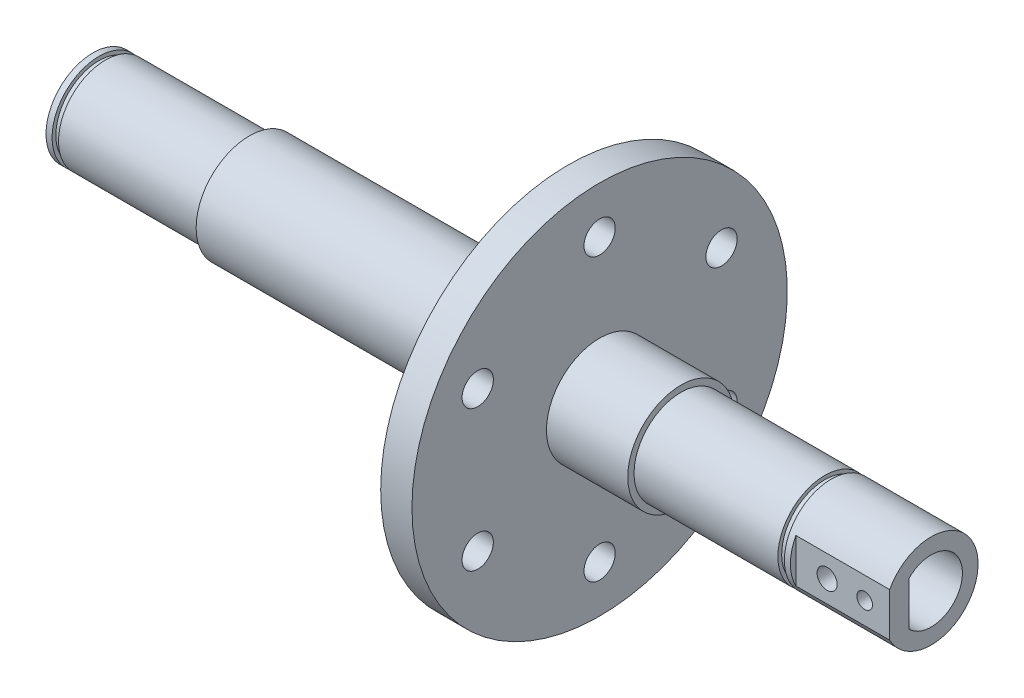
ISO-10303-21;
HEADER;
FILE_DESCRIPTION(('STEP AP214'),'2;1');
FILE_NAME('part.step','',(''),(''),'','','');
FILE_SCHEMA(('AUTOMOTIVE_DESIGN { 1 0 10303 214 1 1 1 1 }'));
ENDSEC;
DATA;
#1=APPLICATION_CONTEXT('core data for automotive mechanical design processes');
#2=APPLICATION_PROTOCOL_DEFINITION('international standard','automotive_design',2000,#1);
#3=PRODUCT_CONTEXT('',#1,'mechanical');
#4=PRODUCT('Part','Part','',(#3));
#5=PRODUCT_RELATED_PRODUCT_CATEGORY('part','',(#4));
#6=PRODUCT_DEFINITION_FORMATION('','',#4);
#7=PRODUCT_DEFINITION_CONTEXT('part definition',#1,'design');
#8=PRODUCT_DEFINITION('design','',#6,#7);
#9=PRODUCT_DEFINITION_SHAPE('','',#8);
#10=(LENGTH_UNIT() NAMED_UNIT(*) SI_UNIT(.MILLI.,.METRE.));
#11=(NAMED_UNIT(*) PLANE_ANGLE_UNIT() SI_UNIT($,.RADIAN.));
#12=(NAMED_UNIT(*) SI_UNIT($,.STERADIAN.) SOLID_ANGLE_UNIT());
#13=UNCERTAINTY_MEASURE_WITH_UNIT(LENGTH_MEASURE(1.E-05),#10,'distance_accuracy_value','');
#14=(GEOMETRIC_REPRESENTATION_CONTEXT(3) GLOBAL_UNCERTAINTY_ASSIGNED_CONTEXT((#13)) GLOBAL_UNIT_ASSIGNED_CONTEXT((#10,
#11,#12)) REPRESENTATION_CONTEXT('',''));
#15=CARTESIAN_POINT('',(0.,0.,0.));
#16=DIRECTION('',(0.,0.,1.));
#17=DIRECTION('',(1.,0.,0.));
#18=AXIS2_PLACEMENT_3D('',#15,#16,#17);
#19=CARTESIAN_POINT('',(0.,0.,0.));
#20=DIRECTION('',(-1.,0.,0.));
#21=DIRECTION('',(0.,0.,1.));
#22=AXIS2_PLACEMENT_3D('',#19,#20,#21);
#23=CYLINDRICAL_SURFACE('',#22,7.5);
#24=CARTESIAN_POINT('',(94.,0.,0.));
#25=DIRECTION('',(-1.,0.,0.));
#26=DIRECTION('',(0.,0.,1.));
#27=AXIS2_PLACEMENT_3D('',#24,#25,#26);
#28=CIRCLE('',#27,7.5);
#29=CARTESIAN_POINT('',(94.,0.,7.5));
#30=VERTEX_POINT('',#29);
#31=EDGE_CURVE('E52',#30,#30,#28,.T.);
#32=ORIENTED_EDGE('',*,*,#31,.F.);
#33=EDGE_LOOP('',(#32));
#34=FACE_BOUND('',#33,.T.);
#35=CARTESIAN_POINT('',(117.,0.,0.));
#36=DIRECTION('',(1.,0.,0.));
#37=DIRECTION('',(0.,1.,0.));
#38=AXIS2_PLACEMENT_3D('',#35,#36,#37);
#39=CIRCLE('',#38,7.5);
#40=CARTESIAN_POINT('',(117.,7.5,0.));
#41=VERTEX_POINT('',#40);
#42=EDGE_CURVE('E217',#41,#41,#39,.T.);
#43=ORIENTED_EDGE('',*,*,#42,.F.);
#44=EDGE_LOOP('',(#43));
#45=FACE_BOUND('',#44,.T.);
#46=ADVANCED_FACE('F43',(#34,#45),#23,.T.);
#47=CARTESIAN_POINT('',(0.,0.,0.));
#48=DIRECTION('',(-1.,0.,0.));
#49=DIRECTION('',(0.,0.,1.));
#50=AXIS2_PLACEMENT_3D('',#47,#48,#49);
#51=CYLINDRICAL_SURFACE('',#50,7.5);
#52=CARTESIAN_POINT('',(25.,0.,0.));
#53=DIRECTION('',(-1.,0.,0.));
#54=DIRECTION('',(0.,0.,1.));
#55=AXIS2_PLACEMENT_3D('',#52,#53,#54);
#56=CIRCLE('',#55,7.5);
#57=CARTESIAN_POINT('',(25.,0.,7.5));
#58=VERTEX_POINT('',#57);
#59=EDGE_CURVE('E178',#58,#58,#56,.T.);
#60=ORIENTED_EDGE('',*,*,#59,.T.);
#61=EDGE_LOOP('',(#60));
#62=FACE_BOUND('',#61,.T.);
#63=CARTESIAN_POINT('',(2.,0.,0.));
#64=DIRECTION('',(-1.,0.,0.));
#65=DIRECTION('',(0.,-1.,0.));
#66=AXIS2_PLACEMENT_3D('',#63,#64,#65);
#67=CIRCLE('',#66,7.5);
#68=CARTESIAN_POINT('',(2.,-7.5,0.));
#69=VERTEX_POINT('',#68);
#70=EDGE_CURVE('E237',#69,#69,#67,.T.);
#71=ORIENTED_EDGE('',*,*,#70,.F.);
#72=EDGE_LOOP('',(#71));
#73=FACE_BOUND('',#72,.T.);
#74=ADVANCED_FACE('F213',(#62,#73),#51,.T.);
#75=CARTESIAN_POINT('',(94.,8.5,0.));
#76=DIRECTION('',(-1.,0.,0.));
#77=DIRECTION('',(0.,0.,1.));
#78=AXIS2_PLACEMENT_3D('',#75,#76,#77);
#79=PLANE('',#78);
#80=CARTESIAN_POINT('',(94.,0.,0.));
#81=DIRECTION('',(-1.,0.,0.));
#82=DIRECTION('',(0.,0.,1.));
#83=AXIS2_PLACEMENT_3D('',#80,#81,#82);
#84=CIRCLE('',#83,8.5);
#85=CARTESIAN_POINT('',(94.,0.,8.5));
#86=VERTEX_POINT('',#85);
#87=EDGE_CURVE('E202',#86,#86,#84,.T.);
#88=ORIENTED_EDGE('',*,*,#87,.F.);
#89=EDGE_LOOP('',(#88));
#90=FACE_BOUND('',#89,.T.);
#91=ORIENTED_EDGE('',*,*,#31,.T.);
#92=EDGE_LOOP('',(#91));
#93=FACE_BOUND('',#92,.T.);
#94=ADVANCED_FACE('F209',(#90,#93),#79,.F.);
#95=CARTESIAN_POINT('',(0.,0.,0.));
#96=DIRECTION('',(-1.,0.,0.));
#97=DIRECTION('',(0.,0.,1.));
#98=AXIS2_PLACEMENT_3D('',#95,#96,#97);
#99=CYLINDRICAL_SURFACE('',#98,8.5);
#100=CARTESIAN_POINT('',(81.,0.,0.));
#101=DIRECTION('',(-1.,0.,0.));
#102=DIRECTION('',(0.,0.,1.));
#103=AXIS2_PLACEMENT_3D('',#100,#101,#102);
#104=CIRCLE('',#103,8.5);
#105=CARTESIAN_POINT('',(81.,0.,8.5));
#106=VERTEX_POINT('',#105);
#107=EDGE_CURVE('E198',#106,#106,#104,.T.);
#108=ORIENTED_EDGE('',*,*,#107,.F.);
#109=EDGE_LOOP('',(#108));
#110=FACE_BOUND('',#109,.T.);
#111=ORIENTED_EDGE('',*,*,#87,.T.);
#112=EDGE_LOOP('',(#111));
#113=FACE_BOUND('',#112,.T.);
#114=ADVANCED_FACE('F332',(#110,#113),#99,.T.);
#115=CARTESIAN_POINT('',(81.,8.5,0.));
#116=DIRECTION('',(-1.,0.,0.));
#117=DIRECTION('',(0.,0.,1.));
#118=AXIS2_PLACEMENT_3D('',#115,#116,#117);
#119=PLANE('',#118);
#120=CARTESIAN_POINT('',(81.,11.2500000000008,19.4855715851503));
#121=DIRECTION('',(-1.,0.,0.));
#122=DIRECTION('',(0.,0.,1.));
#123=AXIS2_PLACEMENT_3D('',#120,#121,#122);
#124=CIRCLE('',#123,2.50000000000027);
#125=CARTESIAN_POINT('',(81.,11.2500000000008,21.9855715851506));
#126=VERTEX_POINT('',#125);
#127=EDGE_CURVE('E162',#126,#126,#124,.T.);
#128=ORIENTED_EDGE('',*,*,#127,.T.);
#129=EDGE_LOOP('',(#128));
#130=FACE_BOUND('',#129,.T.);
#131=CARTESIAN_POINT('',(81.,-11.2499999999992,19.4855715851513));
#132=DIRECTION('',(-1.,0.,0.));
#133=DIRECTION('',(0.,0.,1.));
#134=AXIS2_PLACEMENT_3D('',#131,#132,#133);
#135=CIRCLE('',#134,2.50000000000123);
#136=CARTESIAN_POINT('',(81.,-11.2499999999992,21.9855715851525));
#137=VERTEX_POINT('',#136);
#138=EDGE_CURVE('E158',#137,#137,#135,.T.);
#139=ORIENTED_EDGE('',*,*,#138,.T.);
#140=EDGE_LOOP('',(#139));
#141=FACE_BOUND('',#140,.T.);
#142=CARTESIAN_POINT('',(81.,-22.5,1.91295447595611E-12));
#143=DIRECTION('',(-1.,0.,0.));
#144=DIRECTION('',(0.,0.,1.));
#145=AXIS2_PLACEMENT_3D('',#142,#143,#144);
#146=CIRCLE('',#145,2.50000000000198);
#147=CARTESIAN_POINT('',(81.,-22.5,2.50000000000389));
#148=VERTEX_POINT('',#147);
#149=EDGE_CURVE('E154',#148,#148,#146,.T.);
#150=ORIENTED_EDGE('',*,*,#149,.T.);
#151=EDGE_LOOP('',(#150));
#152=FACE_BOUND('',#151,.T.);
#153=CARTESIAN_POINT('',(81.,-11.2500000000008,-19.4855715851484));
#154=DIRECTION('',(-1.,0.,0.));
#155=DIRECTION('',(0.,0.,1.));
#156=AXIS2_PLACEMENT_3D('',#153,#154,#155);
#157=CIRCLE('',#156,2.50000000000183);
#158=CARTESIAN_POINT('',(81.,-11.2500000000008,-16.9855715851466));
#159=VERTEX_POINT('',#158);
#160=EDGE_CURVE('E150',#159,#159,#157,.T.);
#161=ORIENTED_EDGE('',*,*,#160,.T.);
#162=EDGE_LOOP('',(#161));
#163=FACE_BOUND('',#162,.T.);
#164=CARTESIAN_POINT('',(81.,11.2499999999992,-19.4855715851494));
#165=DIRECTION('',(-1.,0.,0.));
#166=DIRECTION('',(0.,0.,1.));
#167=AXIS2_PLACEMENT_3D('',#164,#165,#166);
#168=CIRCLE('',#167,2.50000000000097);
#169=CARTESIAN_POINT('',(81.,11.2499999999992,-16.9855715851484));
#170=VERTEX_POINT('',#169);
#171=EDGE_CURVE('E131',#170,#170,#168,.T.);
#172=ORIENTED_EDGE('',*,*,#171,.T.);
#173=EDGE_LOOP('',(#172));
#174=FACE_BOUND('',#173,.T.);
#175=CARTESIAN_POINT('',(81.,22.5,0.));
#176=DIRECTION('',(-1.,0.,0.));
#177=DIRECTION('',(0.,0.,1.));
#178=AXIS2_PLACEMENT_3D('',#175,#176,#177);
#179=CIRCLE('',#178,2.5);
#180=CARTESIAN_POINT('',(81.,22.5,2.5));
#181=VERTEX_POINT('',#180);
#182=EDGE_CURVE('E170',#181,#181,#179,.T.);
#183=ORIENTED_EDGE('',*,*,#182,.T.);
#184=EDGE_LOOP('',(#183));
#185=FACE_BOUND('',#184,.T.);
#186=CARTESIAN_POINT('',(81.,0.,0.));
#187=DIRECTION('',(-1.,0.,0.));
#188=DIRECTION('',(0.,0.,1.));
#189=AXIS2_PLACEMENT_3D('',#186,#187,#188);
#190=CIRCLE('',#189,30.);
#191=CARTESIAN_POINT('',(81.,0.,30.));
#192=VERTEX_POINT('',#191);
#193=EDGE_CURVE('E194',#192,#192,#190,.T.);
#194=ORIENTED_EDGE('',*,*,#193,.F.);
#195=EDGE_LOOP('',(#194));
#196=FACE_BOUND('',#195,.T.);
#197=ORIENTED_EDGE('',*,*,#107,.T.);
#198=EDGE_LOOP('',(#197));
#199=FACE_BOUND('',#198,.T.);
#200=ADVANCED_FACE('F336',(#130,#141,#152,#163,#174,#185,#196,#199),#119,.F.);
#201=CARTESIAN_POINT('',(0.,0.,0.));
#202=DIRECTION('',(-1.,0.,0.));
#203=DIRECTION('',(0.,0.,1.));
#204=AXIS2_PLACEMENT_3D('',#201,#202,#203);
#205=CYLINDRICAL_SURFACE('',#204,30.);
#206=CARTESIAN_POINT('',(76.,0.,0.));
#207=DIRECTION('',(-1.,0.,0.));
#208=DIRECTION('',(0.,0.,1.));
#209=AXIS2_PLACEMENT_3D('',#206,#207,#208);
#210=CIRCLE('',#209,30.);
#211=CARTESIAN_POINT('',(76.,0.,30.));
#212=VERTEX_POINT('',#211);
#213=EDGE_CURVE('E190',#212,#212,#210,.T.);
#214=ORIENTED_EDGE('',*,*,#213,.F.);
#215=EDGE_LOOP('',(#214));
#216=FACE_BOUND('',#215,.T.);
#217=ORIENTED_EDGE('',*,*,#193,.T.);
#218=EDGE_LOOP('',(#217));
#219=FACE_BOUND('',#218,.T.);
#220=ADVANCED_FACE('F340',(#216,#219),#205,.T.);
#221=CARTESIAN_POINT('',(76.,30.,0.));
#222=DIRECTION('',(1.,0.,0.));
#223=DIRECTION('',(0.,0.,-1.));
#224=AXIS2_PLACEMENT_3D('',#221,#222,#223);
#225=PLANE('',#224);
#226=CARTESIAN_POINT('',(76.,11.2500000000008,19.4855715851503));
#227=DIRECTION('',(-1.,0.,0.));
#228=DIRECTION('',(0.,-1.,0.));
#229=AXIS2_PLACEMENT_3D('',#226,#227,#228);
#230=CIRCLE('',#229,2.50000000000027);
#231=CARTESIAN_POINT('',(76.,8.75000000000056,19.4855715851503));
#232=VERTEX_POINT('',#231);
#233=EDGE_CURVE('E127',#232,#232,#230,.T.);
#234=ORIENTED_EDGE('',*,*,#233,.F.);
#235=EDGE_LOOP('',(#234));
#236=FACE_BOUND('',#235,.T.);
#237=CARTESIAN_POINT('',(76.,-11.2499999999992,19.4855715851513));
#238=DIRECTION('',(-1.,0.,0.));
#239=DIRECTION('',(0.,-1.,0.));
#240=AXIS2_PLACEMENT_3D('',#237,#238,#239);
#241=CIRCLE('',#240,2.50000000000123);
#242=CARTESIAN_POINT('',(76.,-13.7500000000004,19.4855715851513));
#243=VERTEX_POINT('',#242);
#244=EDGE_CURVE('E132',#243,#243,#241,.T.);
#245=ORIENTED_EDGE('',*,*,#244,.F.);
#246=EDGE_LOOP('',(#245));
#247=FACE_BOUND('',#246,.T.);
#248=CARTESIAN_POINT('',(76.,-22.5,1.91295447595611E-12));
#249=DIRECTION('',(-1.,0.,0.));
#250=DIRECTION('',(0.,-1.,0.));
#251=AXIS2_PLACEMENT_3D('',#248,#249,#250);
#252=CIRCLE('',#251,2.50000000000198);
#253=CARTESIAN_POINT('',(76.,-25.000000000002,1.91295447595611E-12));
#254=VERTEX_POINT('',#253);
#255=EDGE_CURVE('E136',#254,#254,#252,.T.);
#256=ORIENTED_EDGE('',*,*,#255,.F.);
#257=EDGE_LOOP('',(#256));
#258=FACE_BOUND('',#257,.T.);
#259=CARTESIAN_POINT('',(76.,-11.2500000000008,-19.4855715851484));
#260=DIRECTION('',(-1.,0.,0.));
#261=DIRECTION('',(0.,-1.,0.));
#262=AXIS2_PLACEMENT_3D('',#259,#260,#261);
#263=CIRCLE('',#262,2.50000000000183);
#264=CARTESIAN_POINT('',(76.,-13.7500000000027,-19.4855715851484));
#265=VERTEX_POINT('',#264);
#266=EDGE_CURVE('E140',#265,#265,#263,.T.);
#267=ORIENTED_EDGE('',*,*,#266,.F.);
#268=EDGE_LOOP('',(#267));
#269=FACE_BOUND('',#268,.T.);
#270=CARTESIAN_POINT('',(76.,11.2499999999992,-19.4855715851494));
#271=DIRECTION('',(-1.,0.,0.));
#272=DIRECTION('',(0.,-1.,0.));
#273=AXIS2_PLACEMENT_3D('',#270,#271,#272);
#274=CIRCLE('',#273,2.50000000000097);
#275=CARTESIAN_POINT('',(76.,8.74999999999819,-19.4855715851494));
#276=VERTEX_POINT('',#275);
#277=EDGE_CURVE('E124',#276,#276,#274,.T.);
#278=ORIENTED_EDGE('',*,*,#277,.F.);
#279=EDGE_LOOP('',(#278));
#280=FACE_BOUND('',#279,.T.);
#281=CARTESIAN_POINT('',(76.,22.5,0.));
#282=DIRECTION('',(-1.,0.,0.));
#283=DIRECTION('',(0.,-1.,0.));
#284=AXIS2_PLACEMENT_3D('',#281,#282,#283);
#285=CIRCLE('',#284,2.5);
#286=CARTESIAN_POINT('',(76.,20.,0.));
#287=VERTEX_POINT('',#286);
#288=EDGE_CURVE('E166',#287,#287,#285,.T.);
#289=ORIENTED_EDGE('',*,*,#288,.F.);
#290=EDGE_LOOP('',(#289));
#291=FACE_BOUND('',#290,.T.);
#292=CARTESIAN_POINT('',(76.,0.,0.));
#293=DIRECTION('',(-1.,0.,0.));
#294=DIRECTION('',(0.,0.,1.));
#295=AXIS2_PLACEMENT_3D('',#292,#293,#294);
#296=CIRCLE('',#295,8.5);
#297=CARTESIAN_POINT('',(76.,0.,8.5));
#298=VERTEX_POINT('',#297);
#299=EDGE_CURVE('E186',#298,#298,#296,.T.);
#300=ORIENTED_EDGE('',*,*,#299,.F.);
#301=EDGE_LOOP('',(#300));
#302=FACE_BOUND('',#301,.T.);
#303=ORIENTED_EDGE('',*,*,#213,.T.);
#304=EDGE_LOOP('',(#303));
#305=FACE_BOUND('',#304,.T.);
#306=ADVANCED_FACE('F344',(#236,#247,#258,#269,#280,#291,#302,#305),#225,.F.);
#307=CARTESIAN_POINT('',(0.,0.,0.));
#308=DIRECTION('',(-1.,0.,0.));
#309=DIRECTION('',(0.,0.,1.));
#310=AXIS2_PLACEMENT_3D('',#307,#308,#309);
#311=CYLINDRICAL_SURFACE('',#310,8.5);
#312=CARTESIAN_POINT('',(25.,0.,0.));
#313=DIRECTION('',(-1.,0.,0.));
#314=DIRECTION('',(0.,0.,1.));
#315=AXIS2_PLACEMENT_3D('',#312,#313,#314);
#316=CIRCLE('',#315,8.49999999999999);
#317=CARTESIAN_POINT('',(25.,0.,8.49999999999999));
#318=VERTEX_POINT('',#317);
#319=EDGE_CURVE('E182',#318,#318,#316,.T.);
#320=ORIENTED_EDGE('',*,*,#319,.F.);
#321=EDGE_LOOP('',(#320));
#322=FACE_BOUND('',#321,.T.);
#323=ORIENTED_EDGE('',*,*,#299,.T.);
#324=EDGE_LOOP('',(#323));
#325=FACE_BOUND('',#324,.T.);
#326=ADVANCED_FACE('F348',(#322,#325),#311,.T.);
#327=CARTESIAN_POINT('',(25.,8.49999999999999,0.));
#328=DIRECTION('',(1.,0.,0.));
#329=DIRECTION('',(0.,0.,-1.));
#330=AXIS2_PLACEMENT_3D('',#327,#328,#329);
#331=PLANE('',#330);
#332=ORIENTED_EDGE('',*,*,#59,.F.);
#333=EDGE_LOOP('',(#332));
#334=FACE_BOUND('',#333,.T.);
#335=ORIENTED_EDGE('',*,*,#319,.T.);
#336=EDGE_LOOP('',(#335));
#337=FACE_BOUND('',#336,.T.);
#338=ADVANCED_FACE('F352',(#334,#337),#331,.F.);
#339=CARTESIAN_POINT('',(134.,22.5,0.));
#340=DIRECTION('',(-1.,0.,0.));
#341=DIRECTION('',(0.,-1.,0.));
#342=AXIS2_PLACEMENT_3D('',#339,#340,#341);
#343=CYLINDRICAL_SURFACE('',#342,2.5);
#344=ORIENTED_EDGE('',*,*,#288,.T.);
#345=EDGE_LOOP('',(#344));
#346=FACE_BOUND('',#345,.T.);
#347=ORIENTED_EDGE('',*,*,#182,.F.);
#348=EDGE_LOOP('',(#347));
#349=FACE_BOUND('',#348,.T.);
#350=ADVANCED_FACE('F356',(#346,#349),#343,.F.);
#351=CARTESIAN_POINT('',(134.,11.2499999999992,-19.4855715851494));
#352=DIRECTION('',(-1.,0.,0.));
#353=DIRECTION('',(0.,-1.,0.));
#354=AXIS2_PLACEMENT_3D('',#351,#352,#353);
#355=CYLINDRICAL_SURFACE('',#354,2.50000000000097);
#356=ORIENTED_EDGE('',*,*,#277,.T.);
#357=EDGE_LOOP('',(#356));
#358=FACE_BOUND('',#357,.T.);
#359=ORIENTED_EDGE('',*,*,#171,.F.);
#360=EDGE_LOOP('',(#359));
#361=FACE_BOUND('',#360,.T.);
#362=ADVANCED_FACE('F365',(#358,#361),#355,.F.);
#363=CARTESIAN_POINT('',(134.,-11.2500000000008,-19.4855715851484));
#364=DIRECTION('',(-1.,0.,0.));
#365=DIRECTION('',(0.,-1.,0.));
#366=AXIS2_PLACEMENT_3D('',#363,#364,#365);
#367=CYLINDRICAL_SURFACE('',#366,2.50000000000183);
#368=ORIENTED_EDGE('',*,*,#266,.T.);
#369=EDGE_LOOP('',(#368));
#370=FACE_BOUND('',#369,.T.);
#371=ORIENTED_EDGE('',*,*,#160,.F.);
#372=EDGE_LOOP('',(#371));
#373=FACE_BOUND('',#372,.T.);
#374=ADVANCED_FACE('F369',(#370,#373),#367,.F.);
#375=CARTESIAN_POINT('',(134.,-22.5,1.91295447595611E-12));
#376=DIRECTION('',(-1.,0.,0.));
#377=DIRECTION('',(0.,-1.,0.));
#378=AXIS2_PLACEMENT_3D('',#375,#376,#377);
#379=CYLINDRICAL_SURFACE('',#378,2.50000000000198);
#380=ORIENTED_EDGE('',*,*,#255,.T.);
#381=EDGE_LOOP('',(#380));
#382=FACE_BOUND('',#381,.T.);
#383=ORIENTED_EDGE('',*,*,#149,.F.);
#384=EDGE_LOOP('',(#383));
#385=FACE_BOUND('',#384,.T.);
#386=ADVANCED_FACE('F373',(#382,#385),#379,.F.);
#387=CARTESIAN_POINT('',(134.,-11.2499999999992,19.4855715851513));
#388=DIRECTION('',(-1.,0.,0.));
#389=DIRECTION('',(0.,-1.,0.));
#390=AXIS2_PLACEMENT_3D('',#387,#388,#389);
#391=CYLINDRICAL_SURFACE('',#390,2.50000000000123);
#392=ORIENTED_EDGE('',*,*,#244,.T.);
#393=EDGE_LOOP('',(#392));
#394=FACE_BOUND('',#393,.T.);
#395=ORIENTED_EDGE('',*,*,#138,.F.);
#396=EDGE_LOOP('',(#395));
#397=FACE_BOUND('',#396,.T.);
#398=ADVANCED_FACE('F377',(#394,#397),#391,.F.);
#399=CARTESIAN_POINT('',(134.,11.2500000000008,19.4855715851503));
#400=DIRECTION('',(-1.,0.,0.));
#401=DIRECTION('',(0.,-1.,0.));
#402=AXIS2_PLACEMENT_3D('',#399,#400,#401);
#403=CYLINDRICAL_SURFACE('',#402,2.50000000000027);
#404=ORIENTED_EDGE('',*,*,#233,.T.);
#405=EDGE_LOOP('',(#404));
#406=FACE_BOUND('',#405,.T.);
#407=ORIENTED_EDGE('',*,*,#127,.F.);
#408=EDGE_LOOP('',(#407));
#409=FACE_BOUND('',#408,.T.);
#410=ADVANCED_FACE('F380',(#406,#409),#403,.F.);
#411=CARTESIAN_POINT('',(0.97,0.,0.));
#412=DIRECTION('',(-1.,0.,0.));
#413=DIRECTION('',(0.,-1.,0.));
#414=AXIS2_PLACEMENT_3D('',#411,#412,#413);
#415=PLANE('',#414);
#416=CARTESIAN_POINT('',(0.97,0.,0.));
#417=DIRECTION('',(-1.,0.,0.));
#418=DIRECTION('',(0.,-1.,0.));
#419=AXIS2_PLACEMENT_3D('',#416,#417,#418);
#420=CIRCLE('',#419,7.5);
#421=CARTESIAN_POINT('',(0.97,-7.5,0.));
#422=VERTEX_POINT('',#421);
#423=EDGE_CURVE('E241',#422,#422,#420,.T.);
#424=ORIENTED_EDGE('',*,*,#423,.F.);
#425=EDGE_LOOP('',(#424));
#426=FACE_BOUND('',#425,.T.);
#427=CARTESIAN_POINT('',(0.97,0.,0.));
#428=DIRECTION('',(-1.,0.,0.));
#429=DIRECTION('',(0.,-1.,0.));
#430=AXIS2_PLACEMENT_3D('',#427,#428,#429);
#431=CIRCLE('',#430,6.9);
#432=CARTESIAN_POINT('',(0.97,-6.9,0.));
#433=VERTEX_POINT('',#432);
#434=EDGE_CURVE('E233',#433,#433,#431,.T.);
#435=ORIENTED_EDGE('',*,*,#434,.T.);
#436=EDGE_LOOP('',(#435));
#437=FACE_BOUND('',#436,.T.);
#438=ADVANCED_FACE('F383',(#426,#437),#415,.F.);
#439=CARTESIAN_POINT('',(2.,0.,0.));
#440=DIRECTION('',(-1.,0.,0.));
#441=DIRECTION('',(0.,-1.,0.));
#442=AXIS2_PLACEMENT_3D('',#439,#440,#441);
#443=PLANE('',#442);
#444=ORIENTED_EDGE('',*,*,#70,.T.);
#445=EDGE_LOOP('',(#444));
#446=FACE_BOUND('',#445,.T.);
#447=CARTESIAN_POINT('',(2.,0.,0.));
#448=DIRECTION('',(-1.,0.,0.));
#449=DIRECTION('',(0.,-1.,0.));
#450=AXIS2_PLACEMENT_3D('',#447,#448,#449);
#451=CIRCLE('',#450,6.9);
#452=CARTESIAN_POINT('',(2.,-6.9,0.));
#453=VERTEX_POINT('',#452);
#454=EDGE_CURVE('E226',#453,#453,#451,.T.);
#455=ORIENTED_EDGE('',*,*,#454,.F.);
#456=EDGE_LOOP('',(#455));
#457=FACE_BOUND('',#456,.T.);
#458=ADVANCED_FACE('F388',(#446,#457),#443,.T.);
#459=CARTESIAN_POINT('',(0.97,0.,0.));
#460=DIRECTION('',(1.,0.,0.));
#461=DIRECTION('',(0.,1.,0.));
#462=AXIS2_PLACEMENT_3D('',#459,#460,#461);
#463=CYLINDRICAL_SURFACE('',#462,6.9);
#464=ORIENTED_EDGE('',*,*,#434,.F.);
#465=EDGE_LOOP('',(#464));
#466=FACE_BOUND('',#465,.T.);
#467=ORIENTED_EDGE('',*,*,#454,.T.);
#468=EDGE_LOOP('',(#467));
#469=FACE_BOUND('',#468,.T.);
#470=ADVANCED_FACE('F434',(#466,#469),#463,.T.);
#471=CARTESIAN_POINT('',(0.,7.5,0.));
#472=DIRECTION('',(1.,0.,0.));
#473=DIRECTION('',(0.,0.,-1.));
#474=AXIS2_PLACEMENT_3D('',#471,#472,#473);
#475=PLANE('',#474);
#476=CARTESIAN_POINT('',(0.,0.,0.));
#477=DIRECTION('',(-1.,0.,0.));
#478=DIRECTION('',(0.,0.,1.));
#479=AXIS2_PLACEMENT_3D('',#476,#477,#478);
#480=CIRCLE('',#479,7.5);
#481=CARTESIAN_POINT('',(0.,0.,7.5));
#482=VERTEX_POINT('',#481);
#483=EDGE_CURVE('E174',#482,#482,#480,.T.);
#484=ORIENTED_EDGE('',*,*,#483,.T.);
#485=EDGE_LOOP('',(#484));
#486=FACE_BOUND('',#485,.T.);
#487=ADVANCED_FACE('F45',(#486),#475,.F.);
#488=ORIENTED_EDGE('',*,*,#423,.T.);
#489=EDGE_LOOP('',(#488));
#490=FACE_BOUND('',#489,.T.);
#491=ORIENTED_EDGE('',*,*,#483,.F.);
#492=EDGE_LOOP('',(#491));
#493=FACE_BOUND('',#492,.T.);
#494=ADVANCED_FACE('F358',(#490,#493),#51,.T.);
#495=CARTESIAN_POINT('',(118.03,0.,0.));
#496=DIRECTION('',(1.,0.,0.));
#497=DIRECTION('',(0.,1.,0.));
#498=AXIS2_PLACEMENT_3D('',#495,#496,#497);
#499=PLANE('',#498);
#500=CARTESIAN_POINT('',(118.03,0.,0.));
#501=DIRECTION('',(1.,0.,0.));
#502=DIRECTION('',(0.,1.,0.));
#503=AXIS2_PLACEMENT_3D('',#500,#501,#502);
#504=CIRCLE('',#503,7.5);
#505=CARTESIAN_POINT('',(118.03,7.5,0.));
#506=VERTEX_POINT('',#505);
#507=EDGE_CURVE('E220',#506,#506,#504,.T.);
#508=ORIENTED_EDGE('',*,*,#507,.F.);
#509=EDGE_LOOP('',(#508));
#510=FACE_BOUND('',#509,.T.);
#511=CARTESIAN_POINT('',(118.03,0.,0.));
#512=DIRECTION('',(1.,0.,0.));
#513=DIRECTION('',(0.,1.,0.));
#514=AXIS2_PLACEMENT_3D('',#511,#512,#513);
#515=CIRCLE('',#514,6.9);
#516=CARTESIAN_POINT('',(118.03,6.9,0.));
#517=VERTEX_POINT('',#516);
#518=EDGE_CURVE('E221',#517,#517,#515,.T.);
#519=ORIENTED_EDGE('',*,*,#518,.T.);
#520=EDGE_LOOP('',(#519));
#521=FACE_BOUND('',#520,.T.);
#522=ADVANCED_FACE('F361',(#510,#521),#499,.F.);
#523=CARTESIAN_POINT('',(117.,0.,0.));
#524=DIRECTION('',(1.,0.,0.));
#525=DIRECTION('',(0.,1.,0.));
#526=AXIS2_PLACEMENT_3D('',#523,#524,#525);
#527=PLANE('',#526);
#528=ORIENTED_EDGE('',*,*,#42,.T.);
#529=EDGE_LOOP('',(#528));
#530=FACE_BOUND('',#529,.T.);
#531=CARTESIAN_POINT('',(117.,0.,0.));
#532=DIRECTION('',(1.,0.,0.));
#533=DIRECTION('',(0.,1.,0.));
#534=AXIS2_PLACEMENT_3D('',#531,#532,#533);
#535=CIRCLE('',#534,6.9);
#536=CARTESIAN_POINT('',(117.,6.9,0.));
#537=VERTEX_POINT('',#536);
#538=EDGE_CURVE('E229',#537,#537,#535,.T.);
#539=ORIENTED_EDGE('',*,*,#538,.F.);
#540=EDGE_LOOP('',(#539));
#541=FACE_BOUND('',#540,.T.);
#542=ADVANCED_FACE('F442',(#530,#541),#527,.T.);
#543=CARTESIAN_POINT('',(118.03,0.,0.));
#544=DIRECTION('',(-1.,0.,0.));
#545=DIRECTION('',(0.,-1.,0.));
#546=AXIS2_PLACEMENT_3D('',#543,#544,#545);
#547=CYLINDRICAL_SURFACE('',#546,6.9);
#548=ORIENTED_EDGE('',*,*,#518,.F.);
#549=EDGE_LOOP('',(#548));
#550=FACE_BOUND('',#549,.T.);
#551=ORIENTED_EDGE('',*,*,#538,.T.);
#552=EDGE_LOOP('',(#551));
#553=FACE_BOUND('',#552,.T.);
#554=ADVANCED_FACE('F297',(#550,#553),#547,.T.);
#555=CARTESIAN_POINT('',(120.,0.,0.));
#556=DIRECTION('',(1.,0.,0.));
#557=DIRECTION('',(0.,1.,0.));
#558=AXIS2_PLACEMENT_3D('',#555,#556,#557);
#559=PLANE('',#558);
#560=CARTESIAN_POINT('',(120.,0.,0.));
#561=DIRECTION('',(1.,0.,0.));
#562=DIRECTION('',(0.,1.,0.));
#563=AXIS2_PLACEMENT_3D('',#560,#561,#562);
#564=CIRCLE('',#563,5.);
#565=CARTESIAN_POINT('',(120.,-3.5,3.57071421427143));
#566=VERTEX_POINT('',#565);
#567=CARTESIAN_POINT('',(120.,3.5,3.57071421427143));
#568=VERTEX_POINT('',#567);
#569=EDGE_CURVE('E106',#566,#568,#564,.T.);
#570=ORIENTED_EDGE('',*,*,#569,.T.);
#571=DIRECTION('',(0.,-1.,0.));
#572=VECTOR('',#571,1.);
#573=CARTESIAN_POINT('',(120.,3.5,3.57071421427143));
#574=LINE('',#573,#572);
#575=EDGE_CURVE('E110',#568,#566,#574,.T.);
#576=ORIENTED_EDGE('',*,*,#575,.T.);
#577=EDGE_LOOP('',(#570,#576));
#578=FACE_BOUND('',#577,.T.);
#579=ADVANCED_FACE('F295',(#578),#559,.T.);
#580=CARTESIAN_POINT('',(124.,0.,-30.));
#581=DIRECTION('',(0.,0.,1.));
#582=DIRECTION('',(1.,0.,0.));
#583=AXIS2_PLACEMENT_3D('',#580,#581,#582);
#584=CYLINDRICAL_SURFACE('',#583,1.60000000000002);
#585=CARTESIAN_POINT('',(124.,0.,6.6332495807108));
#586=DIRECTION('',(0.,0.,1.));
#587=DIRECTION('',(1.,0.,0.));
#588=AXIS2_PLACEMENT_3D('',#585,#586,#587);
#589=CIRCLE('',#588,1.60000000000002);
#590=CARTESIAN_POINT('',(125.6,0.,6.6332495807108));
#591=VERTEX_POINT('',#590);
#592=EDGE_CURVE('E256',#591,#591,#589,.T.);
#593=ORIENTED_EDGE('',*,*,#592,.T.);
#594=EDGE_LOOP('',(#593));
#595=FACE_BOUND('',#594,.T.);
#596=CARTESIAN_POINT('',(124.,0.,3.57071421427142));
#597=DIRECTION('',(0.,0.,1.));
#598=DIRECTION('',(1.,0.,0.));
#599=AXIS2_PLACEMENT_3D('',#596,#597,#598);
#600=CIRCLE('',#599,1.60000000000002);
#601=CARTESIAN_POINT('',(125.6,0.,3.57071421427142));
#602=VERTEX_POINT('',#601);
#603=EDGE_CURVE('E260',#602,#602,#600,.T.);
#604=ORIENTED_EDGE('',*,*,#603,.F.);
#605=EDGE_LOOP('',(#604));
#606=FACE_BOUND('',#605,.T.);
#607=ADVANCED_FACE('F286',(#595,#606),#584,.F.);
#608=CARTESIAN_POINT('',(130.,0.,6.6332495807108));
#609=DIRECTION('',(0.,0.,1.));
#610=DIRECTION('',(1.,0.,0.));
#611=AXIS2_PLACEMENT_3D('',#608,#609,#610);
#612=CYLINDRICAL_SURFACE('',#611,1.25);
#613=CARTESIAN_POINT('',(130.,0.,6.6332495807108));
#614=DIRECTION('',(0.,0.,1.));
#615=DIRECTION('',(1.,0.,0.));
#616=AXIS2_PLACEMENT_3D('',#613,#614,#615);
#617=CIRCLE('',#616,1.25);
#618=CARTESIAN_POINT('',(131.25,0.,6.6332495807108));
#619=VERTEX_POINT('',#618);
#620=EDGE_CURVE('E245',#619,#619,#617,.T.);
#621=ORIENTED_EDGE('',*,*,#620,.T.);
#622=EDGE_LOOP('',(#621));
#623=FACE_BOUND('',#622,.T.);
#624=CARTESIAN_POINT('',(130.,0.,3.57071421427143));
#625=DIRECTION('',(0.,0.,1.));
#626=DIRECTION('',(1.,0.,0.));
#627=AXIS2_PLACEMENT_3D('',#624,#625,#626);
#628=CIRCLE('',#627,1.25);
#629=CARTESIAN_POINT('',(131.25,0.,3.57071421427143));
#630=VERTEX_POINT('',#629);
#631=EDGE_CURVE('E252',#630,#630,#628,.T.);
#632=ORIENTED_EDGE('',*,*,#631,.F.);
#633=EDGE_LOOP('',(#632));
#634=FACE_BOUND('',#633,.T.);
#635=ADVANCED_FACE('F287',(#623,#634),#612,.F.);
#636=CARTESIAN_POINT('',(120.,3.5,3.57071421427143));
#637=DIRECTION('',(0.,0.,1.));
#638=DIRECTION('',(1.,0.,0.));
#639=AXIS2_PLACEMENT_3D('',#636,#637,#638);
#640=PLANE('',#639);
#641=ORIENTED_EDGE('',*,*,#631,.T.);
#642=EDGE_LOOP('',(#641));
#643=FACE_BOUND('',#642,.T.);
#644=ORIENTED_EDGE('',*,*,#603,.T.);
#645=EDGE_LOOP('',(#644));
#646=FACE_BOUND('',#645,.T.);
#647=DIRECTION('',(0.,-1.,0.));
#648=VECTOR('',#647,1.);
#649=CARTESIAN_POINT('',(134.,3.5,3.57071421427143));
#650=LINE('',#649,#648);
#651=CARTESIAN_POINT('',(134.,3.5,3.57071421427143));
#652=VERTEX_POINT('',#651);
#653=CARTESIAN_POINT('',(134.,-3.5,3.57071421427143));
#654=VERTEX_POINT('',#653);
#655=EDGE_CURVE('E111',#652,#654,#650,.T.);
#656=ORIENTED_EDGE('',*,*,#655,.T.);
#657=DIRECTION('',(1.,0.,0.));
#658=VECTOR('',#657,1.);
#659=CARTESIAN_POINT('',(120.,-3.5,3.57071421427143));
#660=LINE('',#659,#658);
#661=EDGE_CURVE('E121',#566,#654,#660,.T.);
#662=ORIENTED_EDGE('',*,*,#661,.F.);
#663=ORIENTED_EDGE('',*,*,#575,.F.);
#664=DIRECTION('',(1.,0.,0.));
#665=VECTOR('',#664,1.);
#666=CARTESIAN_POINT('',(120.,3.5,3.57071421427143));
#667=LINE('',#666,#665);
#668=EDGE_CURVE('E115',#568,#652,#667,.T.);
#669=ORIENTED_EDGE('',*,*,#668,.T.);
#670=EDGE_LOOP('',(#656,#662,#663,#669));
#671=FACE_BOUND('',#670,.T.);
#672=ADVANCED_FACE('F299',(#643,#646,#671),#640,.F.);
#673=CARTESIAN_POINT('',(120.,0.,0.));
#674=DIRECTION('',(1.,0.,0.));
#675=DIRECTION('',(0.,1.,0.));
#676=AXIS2_PLACEMENT_3D('',#673,#674,#675);
#677=CYLINDRICAL_SURFACE('',#676,5.);
#678=CARTESIAN_POINT('',(125.6,0.,-5.));
#679=CARTESIAN_POINT('',(125.599999756349,-0.0874958063159813,-4.99999978543627));
#680=CARTESIAN_POINT('',(125.592799404721,-0.174994637059064,-4.99768184156355));
#681=CARTESIAN_POINT('',(125.564268180471,-0.347426901237488,-4.98866262172227));
#682=CARTESIAN_POINT('',(125.542934728182,-0.432359863373714,-4.98196054553558));
#683=CARTESIAN_POINT('',(125.486935078788,-0.597149225791573,-4.9649038363541));
#684=CARTESIAN_POINT('',(125.452290107629,-0.677013473384605,-4.95455502045191));
#685=CARTESIAN_POINT('',(125.370743169913,-0.829798762851168,-4.93126901642872));
#686=CARTESIAN_POINT('',(125.323839094234,-0.902718607024957,-4.91833138300385));
#687=CARTESIAN_POINT('',(125.217515886496,-1.041894757795,-4.89077067933825));
#688=CARTESIAN_POINT('',(125.157772901047,-1.10789609224642,-4.87610957732917));
#689=CARTESIAN_POINT('',(125.028156933453,-1.2291342369323,-4.8469706570307));
#690=CARTESIAN_POINT('',(124.958281952345,-1.28436891793799,-4.83249287552328));
#691=CARTESIAN_POINT('',(124.80814714549,-1.38391395073833,-4.80494810799029));
#692=CARTESIAN_POINT('',(124.727663718729,-1.42790123109946,-4.79192785635416));
#693=CARTESIAN_POINT('',(124.55995765623,-1.50160917134592,-4.76934657798645));
#694=CARTESIAN_POINT('',(124.472736902012,-1.53133379773328,-4.75978458968015));
#695=CARTESIAN_POINT('',(124.296917392727,-1.57473134311323,-4.74560122760596));
#696=CARTESIAN_POINT('',(124.208447898248,-1.58887896846388,-4.74083414932744));
#697=CARTESIAN_POINT('',(124.030272400816,-1.60220433058853,-4.73634831044999));
#698=CARTESIAN_POINT('',(123.940566752148,-1.60138627093722,-4.73662813227305));
#699=CARTESIAN_POINT('',(123.766434415112,-1.58517380736383,-4.74207619100074));
#700=CARTESIAN_POINT('',(123.681943546555,-1.57038842132727,-4.74704017430419));
#701=CARTESIAN_POINT('',(123.516711155578,-1.52765058974141,-4.76096457446161));
#702=CARTESIAN_POINT('',(123.435970050415,-1.49969668269329,-4.76992543490024));
#703=CARTESIAN_POINT('',(123.279102141174,-1.43099645158814,-4.79098654163639));
#704=CARTESIAN_POINT('',(123.203063780049,-1.39006273103724,-4.80313229469362));
#705=CARTESIAN_POINT('',(123.058737956973,-1.29669494334069,-4.82917444861167));
#706=CARTESIAN_POINT('',(122.990452597256,-1.24425776827157,-4.8430713221454));
#707=CARTESIAN_POINT('',(122.860135327134,-1.12640551540389,-4.87186372141871));
#708=CARTESIAN_POINT('',(122.798559223061,-1.06048936249404,-4.8867752080818));
#709=CARTESIAN_POINT('',(122.687221321766,-0.919081432217165,-4.91533168114877));
#710=CARTESIAN_POINT('',(122.637460486857,-0.843588875652712,-4.92897656433706));
#711=CARTESIAN_POINT('',(122.55083655672,-0.68426158071239,-4.95361789744584));
#712=CARTESIAN_POINT('',(122.514086899164,-0.600361279440649,-4.96459080547942));
#713=CARTESIAN_POINT('',(122.455360403337,-0.427135850361139,-4.98248161100196));
#714=CARTESIAN_POINT('',(122.433378852183,-0.337812463131553,-4.98940080204637));
#715=CARTESIAN_POINT('',(122.405599933335,-0.16014178958932,-4.99819424239135));
#716=CARTESIAN_POINT('',(122.399185926389,-0.0719002860170746,-5.00026060178154));
#717=CARTESIAN_POINT('',(122.400979218221,0.104410269588107,-4.99968655318444));
#718=CARTESIAN_POINT('',(122.40918426531,0.192479346087442,-4.99704687004206));
#719=CARTESIAN_POINT('',(122.439490113081,0.363535018203817,-4.98748380317497));
#720=CARTESIAN_POINT('',(122.461219910086,0.446594362478029,-4.98067486649266));
#721=CARTESIAN_POINT('',(122.517501799396,0.60786165460059,-4.96357585995349));
#722=CARTESIAN_POINT('',(122.552055496602,0.686068993794134,-4.95328535439546));
#723=CARTESIAN_POINT('',(122.633971017178,0.837596923870455,-4.92995531019905));
#724=CARTESIAN_POINT('',(122.681632511942,0.910745620500976,-4.9168532627009));
#725=CARTESIAN_POINT('',(122.788053872986,1.04821150300663,-4.8893940824048));
#726=CARTESIAN_POINT('',(122.846816886458,1.112526175554,-4.87503659432078));
#727=CARTESIAN_POINT('',(122.976674159611,1.23328321488637,-4.84592967283237));
#728=CARTESIAN_POINT('',(123.048180267688,1.28928579475622,-4.83118884166734));
#729=CARTESIAN_POINT('',(123.199894674458,1.38854141992571,-4.80360443110144));
#730=CARTESIAN_POINT('',(123.280102901454,1.43179457025643,-4.79076083607138));
#731=CARTESIAN_POINT('',(123.446843578656,1.50407580301233,-4.76856262886575));
#732=CARTESIAN_POINT('',(123.53335413499,1.53315066307448,-4.75919656820051));
#733=CARTESIAN_POINT('',(123.71040720981,1.57620668246203,-4.74511281699327));
#734=CARTESIAN_POINT('',(123.800948081136,1.59019395006569,-4.74039324536733));
#735=CARTESIAN_POINT('',(123.978875969164,1.60222535311568,-4.73633927898767));
#736=CARTESIAN_POINT('',(124.066209011329,1.60099388446008,-4.73676019091381));
#737=CARTESIAN_POINT('',(124.239357005435,1.58438355149372,-4.74234159093744));
#738=CARTESIAN_POINT('',(124.325172034561,1.56900540861123,-4.74750183734631));
#739=CARTESIAN_POINT('',(124.491483425377,1.52503332416463,-4.76180543144415));
#740=CARTESIAN_POINT('',(124.572043198893,1.49665627942708,-4.77088327236762));
#741=CARTESIAN_POINT('',(124.727321760401,1.42766427484384,-4.79197975594361));
#742=CARTESIAN_POINT('',(124.802039315763,1.38704674114627,-4.80399901699919));
#743=CARTESIAN_POINT('',(124.946809629814,1.29279266707433,-4.83023494368376));
#744=CARTESIAN_POINT('',(125.016548262734,1.23869308431579,-4.8445211905268));
#745=CARTESIAN_POINT('',(125.146191745821,1.11981399792886,-4.87337180847353));
#746=CARTESIAN_POINT('',(125.206093905199,1.05503158166824,-4.88793625446695));
#747=CARTESIAN_POINT('',(125.316458285924,0.913912210298368,-4.91631108200117));
#748=CARTESIAN_POINT('',(125.366518951884,0.837251351760798,-4.93007751880385));
#749=CARTESIAN_POINT('',(125.452980188097,0.676163529926958,-4.9547378769786));
#750=CARTESIAN_POINT('',(125.489385479321,0.591739263208179,-4.96563279071293));
#751=CARTESIAN_POINT('',(125.54524777983,0.423663431644866,-4.98268341064065));
#752=CARTESIAN_POINT('',(125.565718450583,0.34037676648735,-4.9891190130145));
#753=CARTESIAN_POINT('',(125.593093142904,0.171394001076131,-4.99777693541394));
#754=CARTESIAN_POINT('',(125.600000238645,0.0856984512614005,-5.00000021015613));
#755=CARTESIAN_POINT('',(125.6,0.,-5.));
#756=B_SPLINE_CURVE_WITH_KNOTS('',3,(#678,#679,#680,#681,#682,#683,#684,#685,#686,#687,#688,
#689,#690,#691,#692,#693,#694,#695,#696,#697,#698,#699,#700,#701,#702,#703,#704,#705,#706,#707,
#708,#709,#710,#711,#712,#713,#714,#715,#716,#717,#718,#719,#720,#721,#722,#723,#724,#725,#726,
#727,#728,#729,#730,#731,#732,#733,#734,#735,#736,#737,#738,#739,#740,#741,#742,#743,#744,#745,
#746,#747,#748,#749,#750,#751,#752,#753,#754,#755),.UNSPECIFIED.,.T.,.F.,(4,2,2,2,2,2,2,2,2,2,2,
2,2,2,2,2,2,2,2,2,2,2,2,2,2,2,2,2,2,2,2,2,2,2,2,2,2,2,4),(0.,0.26217228986649,0.524392446348371,
0.786196202111721,1.04804502964705,1.3174971815157,1.58700256668428,1.86354828826629,
2.14001705671958,2.40780489999511,2.67551752794227,2.93207089351449,3.18865273918782,
3.44912195934767,3.70966163813013,3.98267284808628,4.25570628624559,4.531064713342,
4.80633522466355,5.07051010591351,5.33464430132706,5.59183416387796,5.8490562243834,
6.11273355055089,6.37648573964826,6.65122993053069,6.92597185797951,7.19980110675114,
7.47351945288805,7.73426134972858,7.99498995043,8.25151822881327,8.50810048600716,
8.77513756675935,9.04224757485595,9.31866285531271,9.5949824844974,9.85182740305359,
10.1086141011963),.UNSPECIFIED.);
#757=CARTESIAN_POINT('',(125.6,0.,-5.));
#758=VERTEX_POINT('',#757);
#759=EDGE_CURVE('E264',#758,#758,#756,.T.);
#760=ORIENTED_EDGE('',*,*,#759,.T.);
#761=EDGE_LOOP('',(#760));
#762=FACE_BOUND('',#761,.T.);
#763=CARTESIAN_POINT('',(134.,0.,0.));
#764=DIRECTION('',(1.,0.,0.));
#765=DIRECTION('',(0.,1.,0.));
#766=AXIS2_PLACEMENT_3D('',#763,#764,#765);
#767=CIRCLE('',#766,5.);
#768=EDGE_CURVE('E66',#654,#652,#767,.T.);
#769=ORIENTED_EDGE('',*,*,#768,.T.);
#770=ORIENTED_EDGE('',*,*,#668,.F.);
#771=ORIENTED_EDGE('',*,*,#569,.F.);
#772=ORIENTED_EDGE('',*,*,#661,.T.);
#773=EDGE_LOOP('',(#769,#770,#771,#772));
#774=FACE_BOUND('',#773,.T.);
#775=ADVANCED_FACE('F275',(#762,#774),#677,.F.);
#776=CARTESIAN_POINT('',(119.,0.,0.));
#777=DIRECTION('',(1.,0.,0.));
#778=DIRECTION('',(0.,1.,0.));
#779=AXIS2_PLACEMENT_3D('',#776,#777,#778);
#780=PLANE('',#779);
#781=CARTESIAN_POINT('',(119.,0.,0.));
#782=DIRECTION('',(1.,0.,0.));
#783=DIRECTION('',(0.,1.,0.));
#784=AXIS2_PLACEMENT_3D('',#781,#782,#783);
#785=CIRCLE('',#784,7.5);
#786=CARTESIAN_POINT('',(119.,3.5,6.6332495807108));
#787=VERTEX_POINT('',#786);
#788=CARTESIAN_POINT('',(119.,-3.5,6.6332495807108));
#789=VERTEX_POINT('',#788);
#790=EDGE_CURVE('E83',#787,#789,#785,.T.);
#791=ORIENTED_EDGE('',*,*,#790,.T.);
#792=DIRECTION('',(0.,1.,0.));
#793=VECTOR('',#792,1.);
#794=CARTESIAN_POINT('',(119.,3.5,6.6332495807108));
#795=LINE('',#794,#793);
#796=EDGE_CURVE('E58',#789,#787,#795,.T.);
#797=ORIENTED_EDGE('',*,*,#796,.T.);
#798=EDGE_LOOP('',(#791,#797));
#799=FACE_BOUND('',#798,.T.);
#800=ADVANCED_FACE('F84',(#799),#780,.T.);
#801=CARTESIAN_POINT('',(119.,3.5,6.6332495807108));
#802=DIRECTION('',(0.,0.,-1.));
#803=DIRECTION('',(-1.,0.,0.));
#804=AXIS2_PLACEMENT_3D('',#801,#802,#803);
#805=PLANE('',#804);
#806=ORIENTED_EDGE('',*,*,#620,.F.);
#807=EDGE_LOOP('',(#806));
#808=FACE_BOUND('',#807,.T.);
#809=ORIENTED_EDGE('',*,*,#592,.F.);
#810=EDGE_LOOP('',(#809));
#811=FACE_BOUND('',#810,.T.);
#812=DIRECTION('',(0.,1.,0.));
#813=VECTOR('',#812,1.);
#814=CARTESIAN_POINT('',(134.,3.5,6.6332495807108));
#815=LINE('',#814,#813);
#816=CARTESIAN_POINT('',(134.,-3.5,6.6332495807108));
#817=VERTEX_POINT('',#816);
#818=CARTESIAN_POINT('',(134.,3.5,6.6332495807108));
#819=VERTEX_POINT('',#818);
#820=EDGE_CURVE('E89',#817,#819,#815,.T.);
#821=ORIENTED_EDGE('',*,*,#820,.T.);
#822=DIRECTION('',(1.,0.,0.));
#823=VECTOR('',#822,1.);
#824=CARTESIAN_POINT('',(119.,3.5,6.6332495807108));
#825=LINE('',#824,#823);
#826=EDGE_CURVE('E95',#787,#819,#825,.T.);
#827=ORIENTED_EDGE('',*,*,#826,.F.);
#828=ORIENTED_EDGE('',*,*,#796,.F.);
#829=DIRECTION('',(1.,0.,0.));
#830=VECTOR('',#829,1.);
#831=CARTESIAN_POINT('',(119.,-3.5,6.6332495807108));
#832=LINE('',#831,#830);
#833=EDGE_CURVE('E93',#789,#817,#832,.T.);
#834=ORIENTED_EDGE('',*,*,#833,.T.);
#835=EDGE_LOOP('',(#821,#827,#828,#834));
#836=FACE_BOUND('',#835,.T.);
#837=ADVANCED_FACE('F92',(#808,#811,#836),#805,.F.);
#838=CARTESIAN_POINT('',(134.,7.5,0.));
#839=DIRECTION('',(-1.,0.,0.));
#840=DIRECTION('',(0.,0.,1.));
#841=AXIS2_PLACEMENT_3D('',#838,#839,#840);
#842=PLANE('',#841);
#843=ORIENTED_EDGE('',*,*,#655,.F.);
#844=ORIENTED_EDGE('',*,*,#768,.F.);
#845=EDGE_LOOP('',(#843,#844));
#846=FACE_BOUND('',#845,.T.);
#847=CARTESIAN_POINT('',(134.,0.,0.));
#848=DIRECTION('',(-1.,0.,0.));
#849=DIRECTION('',(0.,0.,1.));
#850=AXIS2_PLACEMENT_3D('',#847,#848,#849);
#851=CIRCLE('',#850,7.5);
#852=EDGE_CURVE('E11',#819,#817,#851,.T.);
#853=ORIENTED_EDGE('',*,*,#852,.F.);
#854=ORIENTED_EDGE('',*,*,#820,.F.);
#855=EDGE_LOOP('',(#853,#854));
#856=FACE_BOUND('',#855,.T.);
#857=ADVANCED_FACE('F284',(#846,#856),#842,.F.);
#858=ORIENTED_EDGE('',*,*,#759,.F.);
#859=EDGE_LOOP('',(#858));
#860=FACE_BOUND('',#859,.T.);
#861=CARTESIAN_POINT('',(125.6,0.,-7.5));
#862=CARTESIAN_POINT('',(125.599996894195,0.0887944293338568,-7.4999983570598));
#863=CARTESIAN_POINT('',(125.59258336552,0.177626889700684,-7.49840703800838));
#864=CARTESIAN_POINT('',(125.563153761428,0.352772204992279,-7.49221258982039));
#865=CARTESIAN_POINT('',(125.541126905423,0.439083150622774,-7.48760723719598));
#866=CARTESIAN_POINT('',(125.483189048046,0.606628580180672,-7.47589793294748));
#867=CARTESIAN_POINT('',(125.447292194879,0.687868139445277,-7.46879652810656));
#868=CARTESIAN_POINT('',(125.362677392397,0.843167757727088,-7.45286320133508));
#869=CARTESIAN_POINT('',(125.313959901663,0.917228073407933,-7.4440313413038));
#870=CARTESIAN_POINT('',(125.204297169535,1.0572041936893,-7.42545480782522));
#871=CARTESIAN_POINT('',(125.143193366897,1.12299434543088,-7.41569927510424));
#872=CARTESIAN_POINT('',(125.010833063914,1.24347351522625,-7.39645215099327));
#873=CARTESIAN_POINT('',(124.939575693798,1.29816158128344,-7.38696058229821));
#874=CARTESIAN_POINT('',(124.78800940494,1.39543277767188,-7.36920930951561));
#875=CARTESIAN_POINT('',(124.707613556684,1.43788322502764,-7.36096353805546));
#876=CARTESIAN_POINT('',(124.540624683101,1.50862340101054,-7.34679287525928));
#877=CARTESIAN_POINT('',(124.454032361403,1.53691473453876,-7.34086772090353));
#878=CARTESIAN_POINT('',(124.27846838089,1.57812049535872,-7.33211955105285));
#879=CARTESIAN_POINT('',(124.189551074592,1.59125680705958,-7.32925182047022));
#880=CARTESIAN_POINT('',(124.010731955849,1.60246934089931,-7.32680881403604));
#881=CARTESIAN_POINT('',(123.920830259553,1.60054732105776,-7.32723315384411));
#882=CARTESIAN_POINT('',(123.744236044483,1.58187655808687,-7.33128581769295));
#883=CARTESIAN_POINT('',(123.657514915888,1.56538455643808,-7.33485865843676));
#884=CARTESIAN_POINT('',(123.488099348302,1.51844828834835,-7.34471814062501));
#885=CARTESIAN_POINT('',(123.405405125583,1.48800327344865,-7.35100492764819));
#886=CARTESIAN_POINT('',(123.24566362656,1.41378668233805,-7.36563922179753));
#887=CARTESIAN_POINT('',(123.168664095209,1.36991548636569,-7.37400204199821));
#888=CARTESIAN_POINT('',(123.023024286771,1.27016199217253,-7.39183660364212));
#889=CARTESIAN_POINT('',(122.954385098255,1.21427813244003,-7.40130848917848));
#890=CARTESIAN_POINT('',(122.825935246082,1.09072196751543,-7.4205326849195));
#891=CARTESIAN_POINT('',(122.766334882136,1.02283110172084,-7.43028675890513));
#892=CARTESIAN_POINT('',(122.659332586313,0.877908758701813,-7.44879883076769));
#893=CARTESIAN_POINT('',(122.611930855024,0.800877131200508,-7.45755681226393));
#894=CARTESIAN_POINT('',(122.530623324993,0.639610081827271,-7.4731161994162));
#895=CARTESIAN_POINT('',(122.496744037718,0.555360898326555,-7.47991375438739));
#896=CARTESIAN_POINT('',(122.443680658796,0.382188547319416,-7.49075760800742));
#897=CARTESIAN_POINT('',(122.424494536534,0.293266027489787,-7.49480428682212));
#898=CARTESIAN_POINT('',(122.401665569816,0.115076046551735,-7.49963667143352));
#899=CARTESIAN_POINT('',(122.397735300314,0.0258469966592072,-7.50048267119555));
#900=CARTESIAN_POINT('',(122.404752031212,-0.151992686528005,-7.49898689492793));
#901=CARTESIAN_POINT('',(122.415698074166,-0.240603359252853,-7.49664532405204));
#902=CARTESIAN_POINT('',(122.451918225216,-0.41374606238026,-7.48907546339841));
#903=CARTESIAN_POINT('',(122.477042548525,-0.498310863335308,-7.48387736587364));
#904=CARTESIAN_POINT('',(122.54074058388,-0.662026395792991,-7.47117587533623));
#905=CARTESIAN_POINT('',(122.579315402538,-0.741176681186487,-7.46367229265062));
#906=CARTESIAN_POINT('',(122.669425074618,-0.893011950773014,-7.44704294085318));
#907=CARTESIAN_POINT('',(122.721130026515,-0.965593659738493,-7.43789638159132));
#908=CARTESIAN_POINT('',(122.83580715603,-1.10115356003049,-7.41903990869546));
#909=CARTESIAN_POINT('',(122.898780720812,-1.16413056725133,-7.40932992580373));
#910=CARTESIAN_POINT('',(123.035523439628,-1.27982177561403,-7.39023419815026));
#911=CARTESIAN_POINT('',(123.109461993408,-1.33233743532726,-7.38085708289827));
#912=CARTESIAN_POINT('',(123.265278711512,-1.42420609305474,-7.36368318738414));
#913=CARTESIAN_POINT('',(123.347156538371,-1.46355965021718,-7.35588633999514));
#914=CARTESIAN_POINT('',(123.516094575057,-1.52772807228233,-7.3428278116798));
#915=CARTESIAN_POINT('',(123.60312321577,-1.55262307368946,-7.33755218632522));
#916=CARTESIAN_POINT('',(123.78025472588,-1.58740514879099,-7.33010689029807));
#917=CARTESIAN_POINT('',(123.870357128951,-1.59729448874884,-7.32793675061544));
#918=CARTESIAN_POINT('',(124.049079257277,-1.60169174862621,-7.32697666157729));
#919=CARTESIAN_POINT('',(124.137691020556,-1.59651412882045,-7.3281176057158));
#920=CARTESIAN_POINT('',(124.312748602552,-1.5716247800571,-7.33349539816058));
#921=CARTESIAN_POINT('',(124.399194444253,-1.55191320540034,-7.33773221359929));
#922=CARTESIAN_POINT('',(124.567231244623,-1.49866402761736,-7.34879149338566));
#923=CARTESIAN_POINT('',(124.648836603534,-1.46517005919758,-7.35560579203591));
#924=CARTESIAN_POINT('',(124.805317083691,-1.38534516691847,-7.37105584436333));
#925=CARTESIAN_POINT('',(124.880191542553,-1.33901298148493,-7.37969177702726));
#926=CARTESIAN_POINT('',(125.02263967745,-1.23377464987917,-7.39801997202294));
#927=CARTESIAN_POINT('',(125.090044948253,-1.17464349733654,-7.40772937703983));
#928=CARTESIAN_POINT('',(125.214079532143,-1.04594434807451,-7.42699305436863));
#929=CARTESIAN_POINT('',(125.270706356637,-0.976373947694466,-7.43654729038956));
#930=CARTESIAN_POINT('',(125.372236039457,-0.827748193968458,-7.4545622712928));
#931=CARTESIAN_POINT('',(125.416987309891,-0.748587403501148,-7.46300824065792));
#932=CARTESIAN_POINT('',(125.492478998557,-0.583706040029167,-7.47770774713458));
#933=CARTESIAN_POINT('',(125.523231429929,-0.497991165498192,-7.48396316300769));
#934=CARTESIAN_POINT('',(125.564229762914,-0.343464763103907,-7.49243099511991));
#935=CARTESIAN_POINT('',(125.577618514651,-0.27550283564966,-7.4952520823403));
#936=CARTESIAN_POINT('',(125.595504663999,-0.138368271279888,-7.49903718747764));
#937=CARTESIAN_POINT('',(125.60000242029,-0.069195683318595,-7.5000012803097));
#938=CARTESIAN_POINT('',(125.6,0.,-7.5));
#939=B_SPLINE_CURVE_WITH_KNOTS('',3,(#861,#862,#863,#864,#865,#866,#867,#868,#869,#870,#871,
#872,#873,#874,#875,#876,#877,#878,#879,#880,#881,#882,#883,#884,#885,#886,#887,#888,#889,#890,
#891,#892,#893,#894,#895,#896,#897,#898,#899,#900,#901,#902,#903,#904,#905,#906,#907,#908,#909,
#910,#911,#912,#913,#914,#915,#916,#917,#918,#919,#920,#921,#922,#923,#924,#925,#926,#927,#928,
#929,#930,#931,#932,#933,#934,#935,#936,#937,#938),.UNSPECIFIED.,.T.,.F.,(4,2,2,2,2,2,2,2,2,2,2,
2,2,2,2,2,2,2,2,2,2,2,2,2,2,2,2,2,2,2,2,2,2,2,2,2,2,2,4),(0.,0.266130047854767,
0.532456644597201,0.798512286868067,1.06455841392853,1.33425388789941,1.6039724783216,
1.87651399120588,2.1490246051728,2.41749263134367,2.68592931506414,2.94972810159237,
3.21354104030563,3.47936093436646,3.74521540295252,4.01653060252538,4.28785026321984,
4.55969927797488,4.83151071607132,5.09817555204369,5.36482322613622,5.62870529395046,
5.89260907723851,6.16012360036757,6.42767107713319,6.69989324302723,6.97210384299812,
7.24279095265708,7.51343717712204,7.77847555890156,8.04351112692165,8.30771397733346,
8.57194279940316,8.84126112654229,9.11064156026684,9.38331104903358,9.65574610257715,
9.86314417471916,10.0705338798062),.UNSPECIFIED.);
#940=CARTESIAN_POINT('',(125.6,0.,-7.5));
#941=VERTEX_POINT('',#940);
#942=EDGE_CURVE('E272',#941,#941,#939,.T.);
#943=ORIENTED_EDGE('',*,*,#942,.F.);
#944=EDGE_LOOP('',(#943));
#945=FACE_BOUND('',#944,.T.);
#946=ADVANCED_FACE('F279',(#860,#945),#584,.F.);
#947=ORIENTED_EDGE('',*,*,#507,.T.);
#948=EDGE_LOOP('',(#947));
#949=FACE_BOUND('',#948,.T.);
#950=ORIENTED_EDGE('',*,*,#942,.T.);
#951=EDGE_LOOP('',(#950));
#952=FACE_BOUND('',#951,.T.);
#953=ORIENTED_EDGE('',*,*,#852,.T.);
#954=ORIENTED_EDGE('',*,*,#833,.F.);
#955=ORIENTED_EDGE('',*,*,#790,.F.);
#956=ORIENTED_EDGE('',*,*,#826,.T.);
#957=EDGE_LOOP('',(#953,#954,#955,#956));
#958=FACE_BOUND('',#957,.T.);
#959=ADVANCED_FACE('F98',(#949,#952,#958),#23,.T.);
#960=CLOSED_SHELL('',(#46,#74,#94,#114,#200,#220,#306,#326,#338,#350,#362,#374,#386,#398,#410,
#438,#458,#470,#487,#494,#522,#542,#554,#579,#607,#635,#672,#775,#800,#837,#857,#946,#959));
#961=MANIFOLD_SOLID_BREP('B2',#960);
#962=ADVANCED_BREP_SHAPE_REPRESENTATION('',(#18,#961),#14);
#963=SHAPE_DEFINITION_REPRESENTATION(#9,#962);
ENDSEC;
END-ISO-10303-21;
